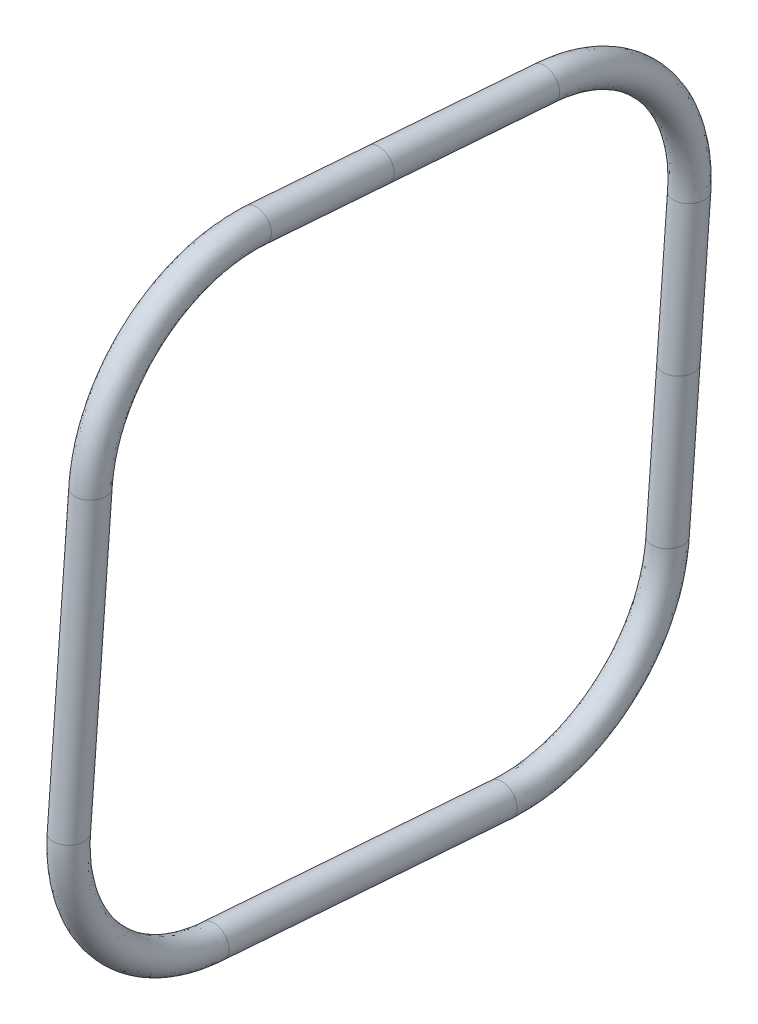
ISO-10303-21;
HEADER;
FILE_DESCRIPTION(('STEP AP214'),'2;1');
FILE_NAME('part.step','',(''),(''),'','','');
FILE_SCHEMA(('AUTOMOTIVE_DESIGN { 1 0 10303 214 1 1 1 1 }'));
ENDSEC;
DATA;
#1=APPLICATION_CONTEXT('core data for automotive mechanical design processes');
#2=APPLICATION_PROTOCOL_DEFINITION('international standard','automotive_design',2000,#1);
#3=PRODUCT_CONTEXT('',#1,'mechanical');
#4=PRODUCT('Part','Part','',(#3));
#5=PRODUCT_RELATED_PRODUCT_CATEGORY('part','',(#4));
#6=PRODUCT_DEFINITION_FORMATION('','',#4);
#7=PRODUCT_DEFINITION_CONTEXT('part definition',#1,'design');
#8=PRODUCT_DEFINITION('design','',#6,#7);
#9=PRODUCT_DEFINITION_SHAPE('','',#8);
#10=(LENGTH_UNIT() NAMED_UNIT(*) SI_UNIT(.MILLI.,.METRE.));
#11=(NAMED_UNIT(*) PLANE_ANGLE_UNIT() SI_UNIT($,.RADIAN.));
#12=(NAMED_UNIT(*) SI_UNIT($,.STERADIAN.) SOLID_ANGLE_UNIT());
#13=UNCERTAINTY_MEASURE_WITH_UNIT(LENGTH_MEASURE(1.E-05),#10,'distance_accuracy_value','');
#14=(GEOMETRIC_REPRESENTATION_CONTEXT(3) GLOBAL_UNCERTAINTY_ASSIGNED_CONTEXT((#13)) GLOBAL_UNIT_ASSIGNED_CONTEXT((#10,
#11,#12)) REPRESENTATION_CONTEXT('',''));
#15=CARTESIAN_POINT('',(0.,0.,0.));
#16=DIRECTION('',(0.,0.,1.));
#17=DIRECTION('',(1.,0.,0.));
#18=AXIS2_PLACEMENT_3D('',#15,#16,#17);
#19=CARTESIAN_POINT('',(0.,32.5979140023121,0.));
#20=CARTESIAN_POINT('',(0.,31.1849477534956,-18.8731077964069));
#21=CARTESIAN_POINT('',(3.47980000030064,32.5979140023121,0.));
#22=CARTESIAN_POINT('',(3.47980000030064,31.1849477534956,-18.8731077964069));
#23=CARTESIAN_POINT('',(3.47980000030064,36.1285140026172,0.));
#24=CARTESIAN_POINT('',(3.47980000030064,34.7155477538008,-18.8731077964069));
#25=CARTESIAN_POINT('',(0.,36.1285140026172,0.));
#26=CARTESIAN_POINT('',(0.,34.7155477538008,-18.8731077964069));
#27=CARTESIAN_POINT('',(-3.47980000030064,36.1285140026172,0.));
#28=CARTESIAN_POINT('',(-3.47980000030064,34.7155477538008,-18.8731077964069));
#29=CARTESIAN_POINT('',(-3.47980000030064,32.5979140023121,0.));
#30=CARTESIAN_POINT('',(-3.47980000030064,31.1849477534956,-18.8731077964069));
#31=CARTESIAN_POINT('',(0.,32.5979140023121,0.));
#32=CARTESIAN_POINT('',(0.,31.1849477534956,-18.8731077964069));
#33=(BOUNDED_SURFACE() B_SPLINE_SURFACE(3,1,((#19,#20),(#21,#22),(#23,#24),(#25,#26),(#27,#28),
(#29,#30),(#31,#32)),.UNSPECIFIED.,.T.,.F.,.F.) B_SPLINE_SURFACE_WITH_KNOTS((4,3,4),(2,2),(0.,
0.5,1.),(0.,1.),.UNSPECIFIED.) GEOMETRIC_REPRESENTATION_ITEM() RATIONAL_B_SPLINE_SURFACE(((1.,
1.),(0.333333333333333,0.333333333333333),(0.333333333333333,0.333333333333333),(1.,1.),
(0.333333333333333,0.333333333333333),(0.333333333333333,0.333333333333333),(1.,1.))) REPRESENTATION_ITEM('') SURFACE());
#34=CARTESIAN_POINT('',(0.,32.9502477536482,-18.8731077964069));
#35=DIRECTION('',(0.,0.,1.));
#36=DIRECTION('',(0.,-1.,0.));
#37=AXIS2_PLACEMENT_3D('',#34,#35,#36);
#38=ELLIPSE('',#37,1.76530000015256,1.73990000015032);
#39=CARTESIAN_POINT('',(0.,31.1849477534956,-18.8731077964069));
#40=VERTEX_POINT('',#39);
#41=EDGE_CURVE('E77',#40,#40,#38,.T.);
#42=CARTESIAN_POINT('',(0.,34.3632140024647,0.));
#43=DIRECTION('',(0.,0.,1.));
#44=DIRECTION('',(0.,-1.,0.));
#45=AXIS2_PLACEMENT_3D('',#42,#43,#44);
#46=ELLIPSE('',#45,1.76530000015256,1.73990000015032);
#47=CARTESIAN_POINT('',(0.,32.5979140023121,0.));
#48=VERTEX_POINT('',#47);
#49=EDGE_CURVE('E80',#48,#48,#46,.T.);
#50=ORIENTED_EDGE('',*,*,#41,.T.);
#51=EDGE_LOOP('',(#50));
#52=FACE_BOUND('',#51,.T.);
#53=ORIENTED_EDGE('',*,*,#49,.F.);
#54=EDGE_LOOP('',(#53));
#55=FACE_BOUND('',#54,.T.);
#56=ADVANCED_FACE('F43',(#52,#55),#33,.F.);
#57=CARTESIAN_POINT('',(0.,31.1849477534957,-18.8731077964068));
#58=CARTESIAN_POINT('',(0.,30.484569307134,-28.2281210018078));
#59=CARTESIAN_POINT('',(0.,23.374333682686,-34.3478719286173));
#60=CARTESIAN_POINT('',(0.,14.0193204772851,-33.6474934822556));
#61=CARTESIAN_POINT('',(3.47980000030064,31.1849477534957,-18.8731077964068));
#62=CARTESIAN_POINT('',(3.47980000030064,30.484569307134,-28.2281210018078));
#63=CARTESIAN_POINT('',(3.47980000030064,23.374333682686,-34.3478719286173));
#64=CARTESIAN_POINT('',(3.47980000030064,14.0193204772851,-33.6474934822556));
#65=CARTESIAN_POINT('',(3.47980000030064,34.7155477538008,-18.8731077964068));
#66=CARTESIAN_POINT('',(3.47980000030064,34.0151693074391,-30.2962985986721));
#67=CARTESIAN_POINT('',(3.47980000030064,25.4425112795503,-37.8784719289224));
#68=CARTESIAN_POINT('',(3.47980000030064,14.0193204772851,-37.1780934825607));
#69=CARTESIAN_POINT('',(0.,34.7155477538008,-18.8731077964068));
#70=CARTESIAN_POINT('',(0.,34.0151693074391,-30.2962985986721));
#71=CARTESIAN_POINT('',(0.,25.4425112795503,-37.8784719289224));
#72=CARTESIAN_POINT('',(0.,14.0193204772851,-37.1780934825607));
#73=CARTESIAN_POINT('',(-3.47980000030064,34.7155477538008,-18.8731077964068));
#74=CARTESIAN_POINT('',(-3.47980000030064,34.0151693074391,-30.2962985986721));
#75=CARTESIAN_POINT('',(-3.47980000030064,25.4425112795503,-37.8784719289224));
#76=CARTESIAN_POINT('',(-3.47980000030064,14.0193204772851,-37.1780934825607));
#77=CARTESIAN_POINT('',(-3.47980000030064,31.1849477534957,-18.8731077964068));
#78=CARTESIAN_POINT('',(-3.47980000030064,30.484569307134,-28.2281210018078));
#79=CARTESIAN_POINT('',(-3.47980000030064,23.374333682686,-34.3478719286173));
#80=CARTESIAN_POINT('',(-3.47980000030064,14.0193204772851,-33.6474934822556));
#81=CARTESIAN_POINT('',(0.,31.1849477534957,-18.8731077964068));
#82=CARTESIAN_POINT('',(0.,30.484569307134,-28.2281210018078));
#83=CARTESIAN_POINT('',(0.,23.374333682686,-34.3478719286173));
#84=CARTESIAN_POINT('',(0.,14.0193204772851,-33.6474934822556));
#85=(BOUNDED_SURFACE() B_SPLINE_SURFACE(3,3,((#57,#58,#59,#60),(#61,#62,#63,#64),(#65,#66,#67,
#68),(#69,#70,#71,#72),(#73,#74,#75,#76),(#77,#78,#79,#80),(#81,#82,#83,#84)),.UNSPECIFIED.,.T.,
.F.,.F.) B_SPLINE_SURFACE_WITH_KNOTS((4,3,4),(4,4),(0.,0.5,1.),(0.,1.),
.UNSPECIFIED.) GEOMETRIC_REPRESENTATION_ITEM() RATIONAL_B_SPLINE_SURFACE(((1.,0.804737854124365,
0.804737854124365,1.),(0.333333333333333,0.268245951374788,0.268245951374788,0.333333333333333),
(0.333333333333333,0.268245951374788,0.268245951374788,0.333333333333333),(1.,0.804737854124365,
0.804737854124365,1.),(0.333333333333333,0.268245951374788,0.268245951374788,0.333333333333333),
(0.333333333333333,0.268245951374788,0.268245951374788,0.333333333333333),(1.,0.804737854124365,
0.804737854124365,1.))) REPRESENTATION_ITEM('') SURFACE());
#86=CARTESIAN_POINT('',(0.,14.019320477285,-35.4127934824082));
#87=DIRECTION('',(0.,1.,0.));
#88=DIRECTION('',(0.,0.,1.));
#89=AXIS2_PLACEMENT_3D('',#86,#87,#88);
#90=ELLIPSE('',#89,1.76530000015256,1.73990000015032);
#91=CARTESIAN_POINT('',(0.,14.019320477285,-33.6474934822556));
#92=VERTEX_POINT('',#91);
#93=EDGE_CURVE('E74',#92,#92,#90,.T.);
#94=ORIENTED_EDGE('',*,*,#93,.T.);
#95=EDGE_LOOP('',(#94));
#96=FACE_BOUND('',#95,.T.);
#97=ORIENTED_EDGE('',*,*,#41,.F.);
#98=EDGE_LOOP('',(#97));
#99=FACE_BOUND('',#98,.T.);
#100=ADVANCED_FACE('F87',(#96,#99),#85,.F.);
#101=CARTESIAN_POINT('',(0.,14.019320477285,-33.6474934822556));
#102=CARTESIAN_POINT('',(0.,-2.42689365955208,-32.4162206178797));
#103=CARTESIAN_POINT('',(3.47980000030064,14.019320477285,-33.6474934822556));
#104=CARTESIAN_POINT('',(3.47980000030064,-2.42689365955208,-32.4162206178797));
#105=CARTESIAN_POINT('',(3.47980000030064,14.019320477285,-37.1780934825608));
#106=CARTESIAN_POINT('',(3.47980000030064,-2.42689365955208,-35.9468206181848));
#107=CARTESIAN_POINT('',(0.,14.019320477285,-37.1780934825608));
#108=CARTESIAN_POINT('',(0.,-2.42689365955208,-35.9468206181848));
#109=CARTESIAN_POINT('',(-3.47980000030064,14.019320477285,-37.1780934825608));
#110=CARTESIAN_POINT('',(-3.47980000030064,-2.42689365955208,-35.9468206181848));
#111=CARTESIAN_POINT('',(-3.47980000030064,14.019320477285,-33.6474934822556));
#112=CARTESIAN_POINT('',(-3.47980000030064,-2.42689365955208,-32.4162206178797));
#113=CARTESIAN_POINT('',(0.,14.019320477285,-33.6474934822556));
#114=CARTESIAN_POINT('',(0.,-2.42689365955208,-32.4162206178797));
#115=(BOUNDED_SURFACE() B_SPLINE_SURFACE(3,1,((#101,#102),(#103,#104),(#105,#106),(#107,#108),
(#109,#110),(#111,#112),(#113,#114)),.UNSPECIFIED.,.T.,.F.,.F.) B_SPLINE_SURFACE_WITH_KNOTS((4,
3,4),(2,2),(0.,0.5,1.),(0.,1.),
.UNSPECIFIED.) GEOMETRIC_REPRESENTATION_ITEM() RATIONAL_B_SPLINE_SURFACE(((1.,1.),
(0.333333333333333,0.333333333333333),(0.333333333333333,0.333333333333333),(1.,1.),
(0.333333333333333,0.333333333333333),(0.333333333333333,0.333333333333333),(1.,1.))) REPRESENTATION_ITEM('') SURFACE());
#116=CARTESIAN_POINT('',(0.,-2.42689365955208,-34.1815206180322));
#117=DIRECTION('',(0.,1.,0.));
#118=DIRECTION('',(0.,0.,1.));
#119=AXIS2_PLACEMENT_3D('',#116,#117,#118);
#120=ELLIPSE('',#119,1.76530000015256,1.73990000015032);
#121=CARTESIAN_POINT('',(0.,-2.42689365955208,-32.4162206178797));
#122=VERTEX_POINT('',#121);
#123=EDGE_CURVE('E71',#122,#122,#120,.T.);
#124=ORIENTED_EDGE('',*,*,#123,.T.);
#125=EDGE_LOOP('',(#124));
#126=FACE_BOUND('',#125,.T.);
#127=ORIENTED_EDGE('',*,*,#93,.F.);
#128=EDGE_LOOP('',(#127));
#129=FACE_BOUND('',#128,.T.);
#130=ADVANCED_FACE('F93',(#126,#129),#115,.F.);
#131=CARTESIAN_POINT('',(0.,-2.42689365955208,-32.4162206178797));
#132=CARTESIAN_POINT('',(0.,-18.8731077963892,-31.1849477535037));
#133=CARTESIAN_POINT('',(3.47980000030064,-2.42689365955208,-32.4162206178797));
#134=CARTESIAN_POINT('',(3.47980000030064,-18.8731077963892,-31.1849477535037));
#135=CARTESIAN_POINT('',(3.47980000030064,-2.42689365955208,-35.9468206181848));
#136=CARTESIAN_POINT('',(3.47980000030064,-18.8731077963892,-34.7155477538088));
#137=CARTESIAN_POINT('',(0.,-2.42689365955208,-35.9468206181848));
#138=CARTESIAN_POINT('',(0.,-18.8731077963892,-34.7155477538088));
#139=CARTESIAN_POINT('',(-3.47980000030064,-2.42689365955208,-35.9468206181848));
#140=CARTESIAN_POINT('',(-3.47980000030064,-18.8731077963892,-34.7155477538088));
#141=CARTESIAN_POINT('',(-3.47980000030064,-2.42689365955208,-32.4162206178797));
#142=CARTESIAN_POINT('',(-3.47980000030064,-18.8731077963892,-31.1849477535037));
#143=CARTESIAN_POINT('',(0.,-2.42689365955208,-32.4162206178797));
#144=CARTESIAN_POINT('',(0.,-18.8731077963892,-31.1849477535037));
#145=(BOUNDED_SURFACE() B_SPLINE_SURFACE(3,1,((#131,#132),(#133,#134),(#135,#136),(#137,#138),
(#139,#140),(#141,#142),(#143,#144)),.UNSPECIFIED.,.T.,.F.,.F.) B_SPLINE_SURFACE_WITH_KNOTS((4,
3,4),(2,2),(0.,0.5,1.),(0.,1.),
.UNSPECIFIED.) GEOMETRIC_REPRESENTATION_ITEM() RATIONAL_B_SPLINE_SURFACE(((1.,1.),
(0.333333333333333,0.333333333333333),(0.333333333333333,0.333333333333333),(1.,1.),
(0.333333333333333,0.333333333333333),(0.333333333333333,0.333333333333333),(1.,1.))) REPRESENTATION_ITEM('') SURFACE());
#146=CARTESIAN_POINT('',(0.,-18.8731077963892,-32.9502477536562));
#147=DIRECTION('',(0.,1.,0.));
#148=DIRECTION('',(0.,0.,1.));
#149=AXIS2_PLACEMENT_3D('',#146,#147,#148);
#150=ELLIPSE('',#149,1.76530000015256,1.73990000015032);
#151=CARTESIAN_POINT('',(0.,-18.8731077963892,-31.1849477535037));
#152=VERTEX_POINT('',#151);
#153=EDGE_CURVE('E68',#152,#152,#150,.T.);
#154=ORIENTED_EDGE('',*,*,#153,.T.);
#155=EDGE_LOOP('',(#154));
#156=FACE_BOUND('',#155,.T.);
#157=ORIENTED_EDGE('',*,*,#123,.F.);
#158=EDGE_LOOP('',(#157));
#159=FACE_BOUND('',#158,.T.);
#160=ADVANCED_FACE('F115',(#156,#159),#145,.F.);
#161=CARTESIAN_POINT('',(0.,-18.8731077963892,-31.1849477535037));
#162=CARTESIAN_POINT('',(0.,-28.2281210017902,-30.484569307142));
#163=CARTESIAN_POINT('',(0.,-34.3478719285997,-23.374333682694));
#164=CARTESIAN_POINT('',(0.,-33.6474934822381,-14.0193204772931));
#165=CARTESIAN_POINT('',(3.47980000030064,-18.8731077963892,-31.1849477535037));
#166=CARTESIAN_POINT('',(3.47980000030064,-28.2281210017902,-30.484569307142));
#167=CARTESIAN_POINT('',(3.47980000030064,-34.3478719285997,-23.374333682694));
#168=CARTESIAN_POINT('',(3.47980000030064,-33.6474934822381,-14.0193204772931));
#169=CARTESIAN_POINT('',(3.47980000030064,-18.8731077963892,-34.7155477538088));
#170=CARTESIAN_POINT('',(3.47980000030064,-30.2962985986545,-34.0151693074471));
#171=CARTESIAN_POINT('',(3.47980000030064,-37.8784719289048,-25.4425112795583));
#172=CARTESIAN_POINT('',(3.47980000030064,-37.1780934825432,-14.0193204772931));
#173=CARTESIAN_POINT('',(0.,-18.8731077963892,-34.7155477538088));
#174=CARTESIAN_POINT('',(0.,-30.2962985986545,-34.0151693074471));
#175=CARTESIAN_POINT('',(0.,-37.8784719289048,-25.4425112795583));
#176=CARTESIAN_POINT('',(0.,-37.1780934825432,-14.0193204772931));
#177=CARTESIAN_POINT('',(-3.47980000030064,-18.8731077963892,-34.7155477538088));
#178=CARTESIAN_POINT('',(-3.47980000030064,-30.2962985986545,-34.0151693074471));
#179=CARTESIAN_POINT('',(-3.47980000030064,-37.8784719289048,-25.4425112795583));
#180=CARTESIAN_POINT('',(-3.47980000030064,-37.1780934825432,-14.0193204772931));
#181=CARTESIAN_POINT('',(-3.47980000030064,-18.8731077963892,-31.1849477535037));
#182=CARTESIAN_POINT('',(-3.47980000030064,-28.2281210017902,-30.484569307142));
#183=CARTESIAN_POINT('',(-3.47980000030064,-34.3478719285997,-23.374333682694));
#184=CARTESIAN_POINT('',(-3.47980000030064,-33.6474934822381,-14.0193204772931));
#185=CARTESIAN_POINT('',(0.,-18.8731077963892,-31.1849477535037));
#186=CARTESIAN_POINT('',(0.,-28.2281210017902,-30.484569307142));
#187=CARTESIAN_POINT('',(0.,-34.3478719285997,-23.374333682694));
#188=CARTESIAN_POINT('',(0.,-33.6474934822381,-14.0193204772931));
#189=(BOUNDED_SURFACE() B_SPLINE_SURFACE(3,3,((#161,#162,#163,#164),(#165,#166,#167,#168),(#169,
#170,#171,#172),(#173,#174,#175,#176),(#177,#178,#179,#180),(#181,#182,#183,#184),(#185,#186,
#187,#188)),.UNSPECIFIED.,.T.,.F.,.F.) B_SPLINE_SURFACE_WITH_KNOTS((4,3,4),(4,4),(0.,0.5,1.),
(0.,1.),.UNSPECIFIED.) GEOMETRIC_REPRESENTATION_ITEM() RATIONAL_B_SPLINE_SURFACE(((1.,
0.804737854124366,0.804737854124366,1.),(0.333333333333333,0.268245951374789,0.268245951374789,
0.333333333333333),(0.333333333333333,0.268245951374789,0.268245951374789,0.333333333333333),
(1.,0.804737854124366,0.804737854124366,1.),(0.333333333333333,0.268245951374789,
0.268245951374789,0.333333333333333),(0.333333333333333,0.268245951374789,0.268245951374789,
0.333333333333333),(1.,0.804737854124366,0.804737854124366,1.))) REPRESENTATION_ITEM('') SURFACE());
#190=CARTESIAN_POINT('',(0.,-35.4127934823906,-14.0193204772931));
#191=DIRECTION('',(0.,0.,-1.));
#192=DIRECTION('',(0.,1.,0.));
#193=AXIS2_PLACEMENT_3D('',#190,#191,#192);
#194=ELLIPSE('',#193,1.76530000015256,1.73990000015032);
#195=CARTESIAN_POINT('',(0.,-33.647493482238,-14.019320477293));
#196=VERTEX_POINT('',#195);
#197=EDGE_CURVE('E65',#196,#196,#194,.T.);
#198=ORIENTED_EDGE('',*,*,#197,.T.);
#199=EDGE_LOOP('',(#198));
#200=FACE_BOUND('',#199,.T.);
#201=ORIENTED_EDGE('',*,*,#153,.F.);
#202=EDGE_LOOP('',(#201));
#203=FACE_BOUND('',#202,.T.);
#204=ADVANCED_FACE('F126',(#200,#203),#189,.F.);
#205=CARTESIAN_POINT('',(0.,-33.647493482238,-14.0193204772931));
#206=CARTESIAN_POINT('',(0.,-31.184947753486,18.8731077963813));
#207=CARTESIAN_POINT('',(3.47980000030064,-33.647493482238,-14.0193204772931));
#208=CARTESIAN_POINT('',(3.47980000030064,-31.184947753486,18.8731077963813));
#209=CARTESIAN_POINT('',(3.47980000030064,-37.1780934825432,-14.0193204772931));
#210=CARTESIAN_POINT('',(3.47980000030064,-34.7155477537912,18.8731077963813));
#211=CARTESIAN_POINT('',(0.,-37.1780934825432,-14.0193204772931));
#212=CARTESIAN_POINT('',(0.,-34.7155477537912,18.8731077963813));
#213=CARTESIAN_POINT('',(-3.47980000030064,-37.1780934825432,-14.0193204772931));
#214=CARTESIAN_POINT('',(-3.47980000030064,-34.7155477537912,18.8731077963813));
#215=CARTESIAN_POINT('',(-3.47980000030064,-33.647493482238,-14.0193204772931));
#216=CARTESIAN_POINT('',(-3.47980000030064,-31.184947753486,18.8731077963813));
#217=CARTESIAN_POINT('',(0.,-33.647493482238,-14.0193204772931));
#218=CARTESIAN_POINT('',(0.,-31.184947753486,18.8731077963813));
#219=(BOUNDED_SURFACE() B_SPLINE_SURFACE(3,1,((#205,#206),(#207,#208),(#209,#210),(#211,#212),
(#213,#214),(#215,#216),(#217,#218)),.UNSPECIFIED.,.T.,.F.,.F.) B_SPLINE_SURFACE_WITH_KNOTS((4,
3,4),(2,2),(0.,0.5,1.),(0.,1.),
.UNSPECIFIED.) GEOMETRIC_REPRESENTATION_ITEM() RATIONAL_B_SPLINE_SURFACE(((1.,1.),
(0.333333333333333,0.333333333333333),(0.333333333333333,0.333333333333333),(1.,1.),
(0.333333333333333,0.333333333333333),(0.333333333333333,0.333333333333333),(1.,1.))) REPRESENTATION_ITEM('') SURFACE());
#220=CARTESIAN_POINT('',(0.,-32.9502477536386,18.8731077963812));
#221=DIRECTION('',(0.,0.,-1.));
#222=DIRECTION('',(0.,1.,0.));
#223=AXIS2_PLACEMENT_3D('',#220,#221,#222);
#224=ELLIPSE('',#223,1.76530000015256,1.73990000015032);
#225=CARTESIAN_POINT('',(0.,-31.184947753486,18.8731077963812));
#226=VERTEX_POINT('',#225);
#227=EDGE_CURVE('E60',#226,#226,#224,.T.);
#228=ORIENTED_EDGE('',*,*,#227,.T.);
#229=EDGE_LOOP('',(#228));
#230=FACE_BOUND('',#229,.T.);
#231=ORIENTED_EDGE('',*,*,#197,.F.);
#232=EDGE_LOOP('',(#231));
#233=FACE_BOUND('',#232,.T.);
#234=ADVANCED_FACE('F137',(#230,#233),#219,.F.);
#235=CARTESIAN_POINT('',(0.,-31.184947753486,18.8731077963813));
#236=CARTESIAN_POINT('',(0.,-30.4845693071243,28.2281210017822));
#237=CARTESIAN_POINT('',(0.,-23.3743336826764,34.3478719285917));
#238=CARTESIAN_POINT('',(0.,-14.0193204772754,33.64749348223));
#239=CARTESIAN_POINT('',(3.47980000030064,-31.184947753486,18.8731077963813));
#240=CARTESIAN_POINT('',(3.47980000030064,-30.4845693071243,28.2281210017822));
#241=CARTESIAN_POINT('',(3.47980000030064,-23.3743336826764,34.3478719285917));
#242=CARTESIAN_POINT('',(3.47980000030064,-14.0193204772754,33.64749348223));
#243=CARTESIAN_POINT('',(3.47980000030064,-34.7155477537912,18.8731077963813));
#244=CARTESIAN_POINT('',(3.47980000030064,-34.0151693074295,30.2962985986465));
#245=CARTESIAN_POINT('',(3.47980000030064,-25.4425112795407,37.8784719288968));
#246=CARTESIAN_POINT('',(3.47980000030064,-14.0193204772754,37.1780934825351));
#247=CARTESIAN_POINT('',(0.,-34.7155477537912,18.8731077963813));
#248=CARTESIAN_POINT('',(0.,-34.0151693074295,30.2962985986465));
#249=CARTESIAN_POINT('',(0.,-25.4425112795407,37.8784719288968));
#250=CARTESIAN_POINT('',(0.,-14.0193204772754,37.1780934825351));
#251=CARTESIAN_POINT('',(-3.47980000030064,-34.7155477537912,18.8731077963813));
#252=CARTESIAN_POINT('',(-3.47980000030064,-34.0151693074295,30.2962985986465));
#253=CARTESIAN_POINT('',(-3.47980000030064,-25.4425112795407,37.8784719288968));
#254=CARTESIAN_POINT('',(-3.47980000030064,-14.0193204772754,37.1780934825351));
#255=CARTESIAN_POINT('',(-3.47980000030064,-31.184947753486,18.8731077963813));
#256=CARTESIAN_POINT('',(-3.47980000030064,-30.4845693071243,28.2281210017822));
#257=CARTESIAN_POINT('',(-3.47980000030064,-23.3743336826764,34.3478719285917));
#258=CARTESIAN_POINT('',(-3.47980000030064,-14.0193204772754,33.64749348223));
#259=CARTESIAN_POINT('',(0.,-31.184947753486,18.8731077963813));
#260=CARTESIAN_POINT('',(0.,-30.4845693071243,28.2281210017822));
#261=CARTESIAN_POINT('',(0.,-23.3743336826764,34.3478719285917));
#262=CARTESIAN_POINT('',(0.,-14.0193204772754,33.64749348223));
#263=(BOUNDED_SURFACE() B_SPLINE_SURFACE(3,3,((#235,#236,#237,#238),(#239,#240,#241,#242),(#243,
#244,#245,#246),(#247,#248,#249,#250),(#251,#252,#253,#254),(#255,#256,#257,#258),(#259,#260,
#261,#262)),.UNSPECIFIED.,.T.,.F.,.F.) B_SPLINE_SURFACE_WITH_KNOTS((4,3,4),(4,4),(0.,0.5,1.),
(0.,1.),.UNSPECIFIED.) GEOMETRIC_REPRESENTATION_ITEM() RATIONAL_B_SPLINE_SURFACE(((1.,
0.804737854124366,0.804737854124366,1.),(0.333333333333333,0.268245951374789,0.268245951374789,
0.333333333333333),(0.333333333333333,0.268245951374789,0.268245951374789,0.333333333333333),
(1.,0.804737854124366,0.804737854124366,1.),(0.333333333333333,0.268245951374789,
0.268245951374789,0.333333333333333),(0.333333333333333,0.268245951374789,0.268245951374789,
0.333333333333333),(1.,0.804737854124366,0.804737854124366,1.))) REPRESENTATION_ITEM('') SURFACE());
#264=CARTESIAN_POINT('',(0.,-14.0193204772754,35.4127934823826));
#265=DIRECTION('',(0.,-1.,0.));
#266=DIRECTION('',(0.,0.,-1.));
#267=AXIS2_PLACEMENT_3D('',#264,#265,#266);
#268=ELLIPSE('',#267,1.76530000015256,1.73990000015032);
#269=CARTESIAN_POINT('',(0.,-14.0193204772754,33.64749348223));
#270=VERTEX_POINT('',#269);
#271=EDGE_CURVE('E56',#270,#270,#268,.T.);
#272=ORIENTED_EDGE('',*,*,#271,.T.);
#273=EDGE_LOOP('',(#272));
#274=FACE_BOUND('',#273,.T.);
#275=ORIENTED_EDGE('',*,*,#227,.F.);
#276=EDGE_LOOP('',(#275));
#277=FACE_BOUND('',#276,.T.);
#278=ADVANCED_FACE('F148',(#274,#277),#263,.F.);
#279=CARTESIAN_POINT('',(0.,-14.0193204772754,33.64749348223));
#280=CARTESIAN_POINT('',(0.,18.8731077963989,31.184947753478));
#281=CARTESIAN_POINT('',(3.47980000030064,-14.0193204772754,33.64749348223));
#282=CARTESIAN_POINT('',(3.47980000030064,18.8731077963989,31.184947753478));
#283=CARTESIAN_POINT('',(3.47980000030064,-14.0193204772754,37.1780934825352));
#284=CARTESIAN_POINT('',(3.47980000030064,18.8731077963989,34.7155477537832));
#285=CARTESIAN_POINT('',(0.,-14.0193204772754,37.1780934825352));
#286=CARTESIAN_POINT('',(0.,18.8731077963989,34.7155477537832));
#287=CARTESIAN_POINT('',(-3.47980000030064,-14.0193204772754,37.1780934825352));
#288=CARTESIAN_POINT('',(-3.47980000030064,18.8731077963989,34.7155477537832));
#289=CARTESIAN_POINT('',(-3.47980000030064,-14.0193204772754,33.64749348223));
#290=CARTESIAN_POINT('',(-3.47980000030064,18.8731077963989,31.184947753478));
#291=CARTESIAN_POINT('',(0.,-14.0193204772754,33.64749348223));
#292=CARTESIAN_POINT('',(0.,18.8731077963989,31.184947753478));
#293=(BOUNDED_SURFACE() B_SPLINE_SURFACE(3,1,((#279,#280),(#281,#282),(#283,#284),(#285,#286),
(#287,#288),(#289,#290),(#291,#292)),.UNSPECIFIED.,.T.,.F.,.F.) B_SPLINE_SURFACE_WITH_KNOTS((4,
3,4),(2,2),(0.,0.5,1.),(0.,1.),
.UNSPECIFIED.) GEOMETRIC_REPRESENTATION_ITEM() RATIONAL_B_SPLINE_SURFACE(((1.,1.),
(0.333333333333333,0.333333333333333),(0.333333333333333,0.333333333333333),(1.,1.),
(0.333333333333333,0.333333333333333),(0.333333333333333,0.333333333333333),(1.,1.))) REPRESENTATION_ITEM('') SURFACE());
#294=CARTESIAN_POINT('',(0.,18.8731077963989,32.9502477536306));
#295=DIRECTION('',(0.,-1.,0.));
#296=DIRECTION('',(0.,0.,-1.));
#297=AXIS2_PLACEMENT_3D('',#294,#295,#296);
#298=ELLIPSE('',#297,1.76530000015256,1.73990000015032);
#299=CARTESIAN_POINT('',(0.,18.8731077963989,31.184947753478));
#300=VERTEX_POINT('',#299);
#301=EDGE_CURVE('E52',#300,#300,#298,.T.);
#302=ORIENTED_EDGE('',*,*,#301,.T.);
#303=EDGE_LOOP('',(#302));
#304=FACE_BOUND('',#303,.T.);
#305=ORIENTED_EDGE('',*,*,#271,.F.);
#306=EDGE_LOOP('',(#305));
#307=FACE_BOUND('',#306,.T.);
#308=ADVANCED_FACE('F159',(#304,#307),#293,.F.);
#309=CARTESIAN_POINT('',(0.,18.8731077963989,31.184947753478));
#310=CARTESIAN_POINT('',(0.,28.2281210017998,30.4845693071163));
#311=CARTESIAN_POINT('',(0.,34.3478719286093,23.3743336826684));
#312=CARTESIAN_POINT('',(0.,33.6474934822476,14.0193204772674));
#313=CARTESIAN_POINT('',(3.47980000030064,18.8731077963989,31.184947753478));
#314=CARTESIAN_POINT('',(3.47980000030064,28.2281210017998,30.4845693071163));
#315=CARTESIAN_POINT('',(3.47980000030064,34.3478719286093,23.3743336826684));
#316=CARTESIAN_POINT('',(3.47980000030064,33.6474934822476,14.0193204772674));
#317=CARTESIAN_POINT('',(3.47980000030064,18.8731077963989,34.7155477537832));
#318=CARTESIAN_POINT('',(3.47980000030064,30.2962985986641,34.0151693074215));
#319=CARTESIAN_POINT('',(3.47980000030064,37.8784719289144,25.4425112795327));
#320=CARTESIAN_POINT('',(3.47980000030064,37.1780934825528,14.0193204772674));
#321=CARTESIAN_POINT('',(0.,18.8731077963989,34.7155477537832));
#322=CARTESIAN_POINT('',(0.,30.2962985986641,34.0151693074215));
#323=CARTESIAN_POINT('',(0.,37.8784719289144,25.4425112795327));
#324=CARTESIAN_POINT('',(0.,37.1780934825528,14.0193204772674));
#325=CARTESIAN_POINT('',(-3.47980000030064,18.8731077963989,34.7155477537832));
#326=CARTESIAN_POINT('',(-3.47980000030064,30.2962985986641,34.0151693074215));
#327=CARTESIAN_POINT('',(-3.47980000030064,37.8784719289144,25.4425112795327));
#328=CARTESIAN_POINT('',(-3.47980000030064,37.1780934825528,14.0193204772674));
#329=CARTESIAN_POINT('',(-3.47980000030064,18.8731077963989,31.184947753478));
#330=CARTESIAN_POINT('',(-3.47980000030064,28.2281210017998,30.4845693071163));
#331=CARTESIAN_POINT('',(-3.47980000030064,34.3478719286093,23.3743336826684));
#332=CARTESIAN_POINT('',(-3.47980000030064,33.6474934822476,14.0193204772674));
#333=CARTESIAN_POINT('',(0.,18.8731077963989,31.184947753478));
#334=CARTESIAN_POINT('',(0.,28.2281210017998,30.4845693071163));
#335=CARTESIAN_POINT('',(0.,34.3478719286093,23.3743336826684));
#336=CARTESIAN_POINT('',(0.,33.6474934822476,14.0193204772674));
#337=(BOUNDED_SURFACE() B_SPLINE_SURFACE(3,3,((#309,#310,#311,#312),(#313,#314,#315,#316),(#317,
#318,#319,#320),(#321,#322,#323,#324),(#325,#326,#327,#328),(#329,#330,#331,#332),(#333,#334,
#335,#336)),.UNSPECIFIED.,.T.,.F.,.F.) B_SPLINE_SURFACE_WITH_KNOTS((4,3,4),(4,4),(0.,0.5,1.),
(0.,1.),.UNSPECIFIED.) GEOMETRIC_REPRESENTATION_ITEM() RATIONAL_B_SPLINE_SURFACE(((1.,
0.804737854124366,0.804737854124366,1.),(0.333333333333333,0.268245951374789,0.268245951374789,
0.333333333333333),(0.333333333333333,0.268245951374789,0.268245951374789,0.333333333333333),
(1.,0.804737854124366,0.804737854124366,1.),(0.333333333333333,0.268245951374789,
0.268245951374789,0.333333333333333),(0.333333333333333,0.268245951374789,0.268245951374789,
0.333333333333333),(1.,0.804737854124366,0.804737854124366,1.))) REPRESENTATION_ITEM('') SURFACE());
#338=CARTESIAN_POINT('',(0.,35.4127934824002,14.0193204772674));
#339=DIRECTION('',(0.,0.,1.));
#340=DIRECTION('',(0.,-1.,0.));
#341=AXIS2_PLACEMENT_3D('',#338,#339,#340);
#342=ELLIPSE('',#341,1.76530000015256,1.73990000015032);
#343=CARTESIAN_POINT('',(0.,33.6474934822476,14.0193204772674));
#344=VERTEX_POINT('',#343);
#345=EDGE_CURVE('E12',#344,#344,#342,.T.);
#346=ORIENTED_EDGE('',*,*,#345,.T.);
#347=EDGE_LOOP('',(#346));
#348=FACE_BOUND('',#347,.T.);
#349=ORIENTED_EDGE('',*,*,#301,.F.);
#350=EDGE_LOOP('',(#349));
#351=FACE_BOUND('',#350,.T.);
#352=ADVANCED_FACE('F169',(#348,#351),#337,.F.);
#353=CARTESIAN_POINT('',(0.,33.6474934822477,14.0193204772674));
#354=CARTESIAN_POINT('',(0.,32.5979140023121,0.));
#355=CARTESIAN_POINT('',(3.47980000030064,33.6474934822477,14.0193204772674));
#356=CARTESIAN_POINT('',(3.47980000030064,32.5979140023121,0.));
#357=CARTESIAN_POINT('',(3.47980000030064,37.1780934825528,14.0193204772674));
#358=CARTESIAN_POINT('',(3.47980000030064,36.1285140026172,0.));
#359=CARTESIAN_POINT('',(0.,37.1780934825528,14.0193204772674));
#360=CARTESIAN_POINT('',(0.,36.1285140026172,0.));
#361=CARTESIAN_POINT('',(-3.47980000030064,37.1780934825528,14.0193204772674));
#362=CARTESIAN_POINT('',(-3.47980000030064,36.1285140026172,0.));
#363=CARTESIAN_POINT('',(-3.47980000030064,33.6474934822477,14.0193204772674));
#364=CARTESIAN_POINT('',(-3.47980000030064,32.5979140023121,0.));
#365=CARTESIAN_POINT('',(0.,33.6474934822477,14.0193204772674));
#366=CARTESIAN_POINT('',(0.,32.5979140023121,0.));
#367=(BOUNDED_SURFACE() B_SPLINE_SURFACE(3,1,((#353,#354),(#355,#356),(#357,#358),(#359,#360),
(#361,#362),(#363,#364),(#365,#366)),.UNSPECIFIED.,.T.,.F.,.F.) B_SPLINE_SURFACE_WITH_KNOTS((4,
3,4),(2,2),(0.,0.5,1.),(0.,1.),
.UNSPECIFIED.) GEOMETRIC_REPRESENTATION_ITEM() RATIONAL_B_SPLINE_SURFACE(((1.,1.),
(0.333333333333333,0.333333333333333),(0.333333333333333,0.333333333333333),(1.,1.),
(0.333333333333333,0.333333333333333),(0.333333333333333,0.333333333333333),(1.,1.))) REPRESENTATION_ITEM('') SURFACE());
#368=ORIENTED_EDGE('',*,*,#49,.T.);
#369=EDGE_LOOP('',(#368));
#370=FACE_BOUND('',#369,.T.);
#371=ORIENTED_EDGE('',*,*,#345,.F.);
#372=EDGE_LOOP('',(#371));
#373=FACE_BOUND('',#372,.T.);
#374=ADVANCED_FACE('F45',(#370,#373),#367,.F.);
#375=CLOSED_SHELL('',(#56,#100,#130,#160,#204,#234,#278,#308,#352,#374));
#376=MANIFOLD_SOLID_BREP('B2',#375);
#377=ADVANCED_BREP_SHAPE_REPRESENTATION('',(#18,#376),#14);
#378=SHAPE_DEFINITION_REPRESENTATION(#9,#377);
ENDSEC;
END-ISO-10303-21;
